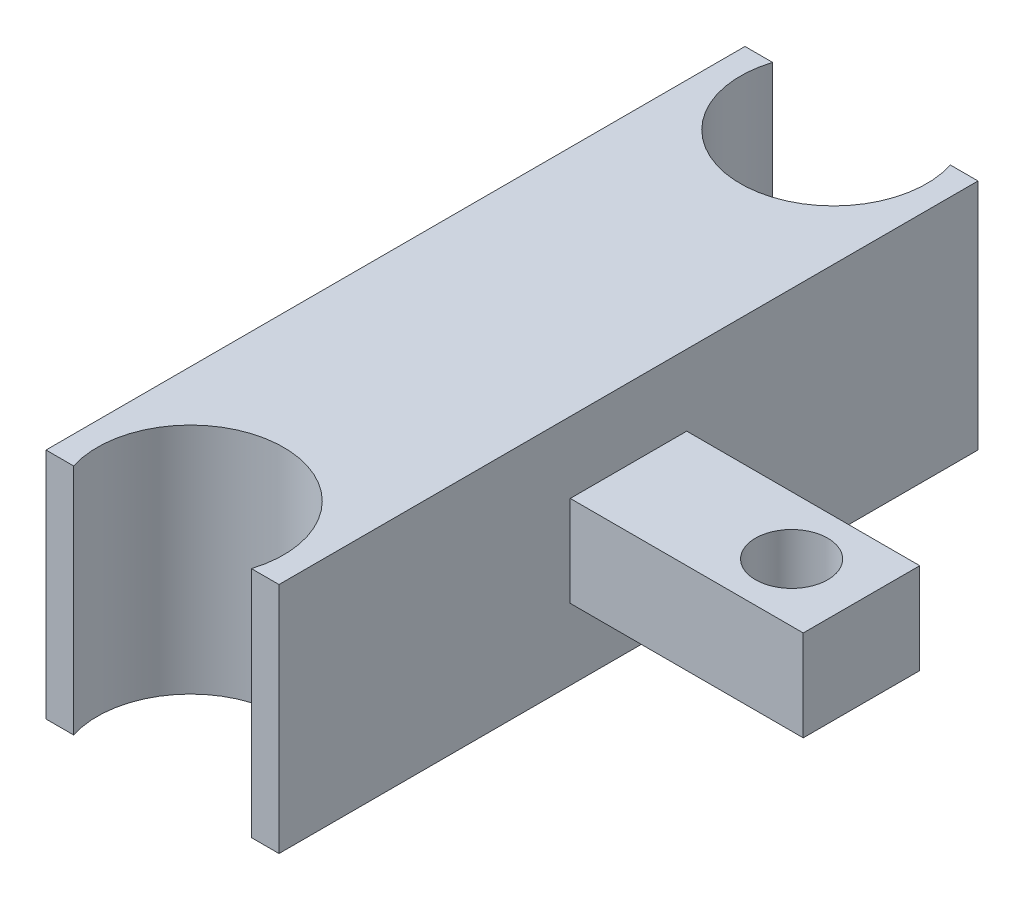
ISO-10303-21;
HEADER;
FILE_DESCRIPTION(('STEP AP214'),'2;1');
FILE_NAME('part.step','',(''),(''),'','','');
FILE_SCHEMA(('AUTOMOTIVE_DESIGN { 1 0 10303 214 1 1 1 1 }'));
ENDSEC;
DATA;
#1=APPLICATION_CONTEXT('core data for automotive mechanical design processes');
#2=APPLICATION_PROTOCOL_DEFINITION('international standard','automotive_design',2000,#1);
#3=PRODUCT_CONTEXT('',#1,'mechanical');
#4=PRODUCT('Part','Part','',(#3));
#5=PRODUCT_RELATED_PRODUCT_CATEGORY('part','',(#4));
#6=PRODUCT_DEFINITION_FORMATION('','',#4);
#7=PRODUCT_DEFINITION_CONTEXT('part definition',#1,'design');
#8=PRODUCT_DEFINITION('design','',#6,#7);
#9=PRODUCT_DEFINITION_SHAPE('','',#8);
#10=(LENGTH_UNIT() NAMED_UNIT(*) SI_UNIT(.MILLI.,.METRE.));
#11=(NAMED_UNIT(*) PLANE_ANGLE_UNIT() SI_UNIT($,.RADIAN.));
#12=(NAMED_UNIT(*) SI_UNIT($,.STERADIAN.) SOLID_ANGLE_UNIT());
#13=UNCERTAINTY_MEASURE_WITH_UNIT(LENGTH_MEASURE(1.E-05),#10,'distance_accuracy_value','');
#14=(GEOMETRIC_REPRESENTATION_CONTEXT(3) GLOBAL_UNCERTAINTY_ASSIGNED_CONTEXT((#13)) GLOBAL_UNIT_ASSIGNED_CONTEXT((#10,
#11,#12)) REPRESENTATION_CONTEXT('',''));
#15=CARTESIAN_POINT('',(0.,0.,0.));
#16=DIRECTION('',(0.,0.,1.));
#17=DIRECTION('',(1.,0.,0.));
#18=AXIS2_PLACEMENT_3D('',#15,#16,#17);
#19=CARTESIAN_POINT('',(-10.,-3.05,-17.5));
#20=DIRECTION('',(0.,0.,1.));
#21=DIRECTION('',(1.,0.,0.));
#22=AXIS2_PLACEMENT_3D('',#19,#20,#21);
#23=PLANE('',#22);
#24=DIRECTION('',(1.,0.,0.));
#25=VECTOR('',#24,1.);
#26=CARTESIAN_POINT('',(-10.,-3.05,-17.5));
#27=LINE('',#26,#25);
#28=CARTESIAN_POINT('',(-1.18424319433222,-3.05,-17.5));
#29=VERTEX_POINT('',#28);
#30=CARTESIAN_POINT('',(0.,-3.05,-17.5));
#31=VERTEX_POINT('',#30);
#32=EDGE_CURVE('E148',#29,#31,#27,.T.);
#33=ORIENTED_EDGE('',*,*,#32,.F.);
#34=DIRECTION('',(0.,1.,0.));
#35=VECTOR('',#34,1.);
#36=CARTESIAN_POINT('',(-1.18424319433222,-3.05,-17.5));
#37=LINE('',#36,#35);
#38=CARTESIAN_POINT('',(-1.18424319433222,6.95,-17.5));
#39=VERTEX_POINT('',#38);
#40=EDGE_CURVE('E267',#29,#39,#37,.T.);
#41=ORIENTED_EDGE('',*,*,#40,.T.);
#42=DIRECTION('',(1.,0.,0.));
#43=VECTOR('',#42,1.);
#44=CARTESIAN_POINT('',(-10.,6.95,-17.5));
#45=LINE('',#44,#43);
#46=CARTESIAN_POINT('',(0.,6.95,-17.5));
#47=VERTEX_POINT('',#46);
#48=EDGE_CURVE('E255',#39,#47,#45,.T.);
#49=ORIENTED_EDGE('',*,*,#48,.T.);
#50=DIRECTION('',(0.,-1.,0.));
#51=VECTOR('',#50,1.);
#52=CARTESIAN_POINT('',(0.,-3.05,-17.5));
#53=LINE('',#52,#51);
#54=EDGE_CURVE('E264',#47,#31,#53,.T.);
#55=ORIENTED_EDGE('',*,*,#54,.T.);
#56=EDGE_LOOP('',(#33,#41,#49,#55));
#57=FACE_BOUND('',#56,.T.);
#58=ADVANCED_FACE('F35',(#57),#23,.F.);
#59=CARTESIAN_POINT('',(-10.,-3.05,12.5));
#60=DIRECTION('',(0.,0.,-1.));
#61=DIRECTION('',(-1.,0.,0.));
#62=AXIS2_PLACEMENT_3D('',#59,#60,#61);
#63=PLANE('',#62);
#64=DIRECTION('',(1.,0.,0.));
#65=VECTOR('',#64,1.);
#66=CARTESIAN_POINT('',(-10.,-3.05,12.5));
#67=LINE('',#66,#65);
#68=CARTESIAN_POINT('',(-10.,-3.05,12.5));
#69=VERTEX_POINT('',#68);
#70=CARTESIAN_POINT('',(-8.81575680566778,-3.05,12.5));
#71=VERTEX_POINT('',#70);
#72=EDGE_CURVE('E145',#69,#71,#67,.T.);
#73=ORIENTED_EDGE('',*,*,#72,.T.);
#74=DIRECTION('',(0.,1.,0.));
#75=VECTOR('',#74,1.);
#76=CARTESIAN_POINT('',(-8.81575680566778,-3.05,12.5));
#77=LINE('',#76,#75);
#78=CARTESIAN_POINT('',(-8.81575680566778,6.95,12.5));
#79=VERTEX_POINT('',#78);
#80=EDGE_CURVE('E124',#71,#79,#77,.T.);
#81=ORIENTED_EDGE('',*,*,#80,.T.);
#82=DIRECTION('',(1.,0.,0.));
#83=VECTOR('',#82,1.);
#84=CARTESIAN_POINT('',(-10.,6.95,12.5));
#85=LINE('',#84,#83);
#86=CARTESIAN_POINT('',(-10.,6.95,12.5));
#87=VERTEX_POINT('',#86);
#88=EDGE_CURVE('E146',#87,#79,#85,.T.);
#89=ORIENTED_EDGE('',*,*,#88,.F.);
#90=DIRECTION('',(0.,1.,0.));
#91=VECTOR('',#90,1.);
#92=CARTESIAN_POINT('',(-10.,-3.05,12.5));
#93=LINE('',#92,#91);
#94=EDGE_CURVE('E269',#69,#87,#93,.T.);
#95=ORIENTED_EDGE('',*,*,#94,.F.);
#96=EDGE_LOOP('',(#73,#81,#89,#95));
#97=FACE_BOUND('',#96,.T.);
#98=ADVANCED_FACE('F212',(#97),#63,.F.);
#99=CARTESIAN_POINT('',(0.,3.9,0.));
#100=DIRECTION('',(0.,-1.,0.));
#101=DIRECTION('',(0.,0.,-1.));
#102=AXIS2_PLACEMENT_3D('',#99,#100,#101);
#103=PLANE('',#102);
#104=DIRECTION('',(0.,0.,1.));
#105=VECTOR('',#104,1.);
#106=CARTESIAN_POINT('',(0.,3.9,0.));
#107=LINE('',#106,#105);
#108=CARTESIAN_POINT('',(0.,3.9,-5.));
#109=VERTEX_POINT('',#108);
#110=CARTESIAN_POINT('',(0.,3.9,0.));
#111=VERTEX_POINT('',#110);
#112=EDGE_CURVE('E162',#109,#111,#107,.T.);
#113=ORIENTED_EDGE('',*,*,#112,.T.);
#114=DIRECTION('',(1.,0.,0.));
#115=VECTOR('',#114,1.);
#116=CARTESIAN_POINT('',(0.,3.9,0.));
#117=LINE('',#116,#115);
#118=CARTESIAN_POINT('',(10.,3.9,0.));
#119=VERTEX_POINT('',#118);
#120=EDGE_CURVE('E165',#111,#119,#117,.T.);
#121=ORIENTED_EDGE('',*,*,#120,.T.);
#122=DIRECTION('',(0.,0.,-1.));
#123=VECTOR('',#122,1.);
#124=CARTESIAN_POINT('',(10.,3.9,0.));
#125=LINE('',#124,#123);
#126=CARTESIAN_POINT('',(10.,3.9,-5.));
#127=VERTEX_POINT('',#126);
#128=EDGE_CURVE('E168',#119,#127,#125,.T.);
#129=ORIENTED_EDGE('',*,*,#128,.T.);
#130=DIRECTION('',(-1.,0.,0.));
#131=VECTOR('',#130,1.);
#132=CARTESIAN_POINT('',(0.,3.9,-5.));
#133=LINE('',#132,#131);
#134=EDGE_CURVE('E170',#127,#109,#133,.T.);
#135=ORIENTED_EDGE('',*,*,#134,.T.);
#136=EDGE_LOOP('',(#113,#121,#129,#135));
#137=FACE_BOUND('',#136,.T.);
#138=CARTESIAN_POINT('',(7.,3.9,-2.5));
#139=DIRECTION('',(0.,1.,0.));
#140=DIRECTION('',(0.,0.,1.));
#141=AXIS2_PLACEMENT_3D('',#138,#139,#140);
#142=CIRCLE('',#141,1.55);
#143=CARTESIAN_POINT('',(7.,3.9,-0.95));
#144=VERTEX_POINT('',#143);
#145=EDGE_CURVE('E156',#144,#144,#142,.T.);
#146=ORIENTED_EDGE('',*,*,#145,.F.);
#147=EDGE_LOOP('',(#146));
#148=FACE_BOUND('',#147,.T.);
#149=ADVANCED_FACE('F209',(#137,#148),#103,.F.);
#150=CARTESIAN_POINT('',(0.,0.,0.));
#151=DIRECTION('',(0.,-1.,0.));
#152=DIRECTION('',(0.,0.,-1.));
#153=AXIS2_PLACEMENT_3D('',#150,#151,#152);
#154=PLANE('',#153);
#155=DIRECTION('',(0.,0.,1.));
#156=VECTOR('',#155,1.);
#157=CARTESIAN_POINT('',(0.,0.,0.));
#158=LINE('',#157,#156);
#159=CARTESIAN_POINT('',(0.,0.,-5.));
#160=VERTEX_POINT('',#159);
#161=CARTESIAN_POINT('',(0.,0.,0.));
#162=VERTEX_POINT('',#161);
#163=EDGE_CURVE('E159',#160,#162,#158,.T.);
#164=ORIENTED_EDGE('',*,*,#163,.F.);
#165=DIRECTION('',(-1.,0.,0.));
#166=VECTOR('',#165,1.);
#167=CARTESIAN_POINT('',(0.,0.,-5.));
#168=LINE('',#167,#166);
#169=CARTESIAN_POINT('',(10.,0.,-5.));
#170=VERTEX_POINT('',#169);
#171=EDGE_CURVE('E166',#170,#160,#168,.T.);
#172=ORIENTED_EDGE('',*,*,#171,.F.);
#173=DIRECTION('',(0.,0.,-1.));
#174=VECTOR('',#173,1.);
#175=CARTESIAN_POINT('',(10.,0.,0.));
#176=LINE('',#175,#174);
#177=CARTESIAN_POINT('',(10.,0.,0.));
#178=VERTEX_POINT('',#177);
#179=EDGE_CURVE('E177',#178,#170,#176,.T.);
#180=ORIENTED_EDGE('',*,*,#179,.F.);
#181=DIRECTION('',(1.,0.,0.));
#182=VECTOR('',#181,1.);
#183=CARTESIAN_POINT('',(0.,0.,0.));
#184=LINE('',#183,#182);
#185=EDGE_CURVE('E175',#162,#178,#184,.T.);
#186=ORIENTED_EDGE('',*,*,#185,.F.);
#187=EDGE_LOOP('',(#164,#172,#180,#186));
#188=FACE_BOUND('',#187,.T.);
#189=CARTESIAN_POINT('',(7.,0.,-2.5));
#190=DIRECTION('',(0.,1.,0.));
#191=DIRECTION('',(0.,0.,1.));
#192=AXIS2_PLACEMENT_3D('',#189,#190,#191);
#193=CIRCLE('',#192,1.55);
#194=CARTESIAN_POINT('',(7.,0.,-0.95));
#195=VERTEX_POINT('',#194);
#196=EDGE_CURVE('E155',#195,#195,#193,.T.);
#197=ORIENTED_EDGE('',*,*,#196,.T.);
#198=EDGE_LOOP('',(#197));
#199=FACE_BOUND('',#198,.T.);
#200=ADVANCED_FACE('F198',(#188,#199),#154,.T.);
#201=CARTESIAN_POINT('',(0.,3.9,0.));
#202=DIRECTION('',(0.,0.,-1.));
#203=DIRECTION('',(-1.,0.,0.));
#204=AXIS2_PLACEMENT_3D('',#201,#202,#203);
#205=PLANE('',#204);
#206=ORIENTED_EDGE('',*,*,#185,.T.);
#207=DIRECTION('',(0.,-1.,0.));
#208=VECTOR('',#207,1.);
#209=CARTESIAN_POINT('',(10.,3.9,0.));
#210=LINE('',#209,#208);
#211=EDGE_CURVE('E186',#119,#178,#210,.T.);
#212=ORIENTED_EDGE('',*,*,#211,.F.);
#213=ORIENTED_EDGE('',*,*,#120,.F.);
#214=DIRECTION('',(0.,-1.,0.));
#215=VECTOR('',#214,1.);
#216=CARTESIAN_POINT('',(0.,3.9,0.));
#217=LINE('',#216,#215);
#218=EDGE_CURVE('E43',#111,#162,#217,.T.);
#219=ORIENTED_EDGE('',*,*,#218,.T.);
#220=EDGE_LOOP('',(#206,#212,#213,#219));
#221=FACE_BOUND('',#220,.T.);
#222=ADVANCED_FACE('F37',(#221),#205,.F.);
#223=CARTESIAN_POINT('',(10.,3.9,0.));
#224=DIRECTION('',(-1.,0.,0.));
#225=DIRECTION('',(0.,0.,1.));
#226=AXIS2_PLACEMENT_3D('',#223,#224,#225);
#227=PLANE('',#226);
#228=ORIENTED_EDGE('',*,*,#179,.T.);
#229=DIRECTION('',(0.,-1.,0.));
#230=VECTOR('',#229,1.);
#231=CARTESIAN_POINT('',(10.,3.9,-5.));
#232=LINE('',#231,#230);
#233=EDGE_CURVE('E183',#127,#170,#232,.T.);
#234=ORIENTED_EDGE('',*,*,#233,.F.);
#235=ORIENTED_EDGE('',*,*,#128,.F.);
#236=ORIENTED_EDGE('',*,*,#211,.T.);
#237=EDGE_LOOP('',(#228,#234,#235,#236));
#238=FACE_BOUND('',#237,.T.);
#239=ADVANCED_FACE('F207',(#238),#227,.F.);
#240=CARTESIAN_POINT('',(0.,3.9,-5.));
#241=DIRECTION('',(0.,0.,1.));
#242=DIRECTION('',(1.,0.,0.));
#243=AXIS2_PLACEMENT_3D('',#240,#241,#242);
#244=PLANE('',#243);
#245=ORIENTED_EDGE('',*,*,#171,.T.);
#246=DIRECTION('',(0.,-1.,0.));
#247=VECTOR('',#246,1.);
#248=CARTESIAN_POINT('',(0.,3.9,-5.));
#249=LINE('',#248,#247);
#250=EDGE_CURVE('E172',#109,#160,#249,.T.);
#251=ORIENTED_EDGE('',*,*,#250,.F.);
#252=ORIENTED_EDGE('',*,*,#134,.F.);
#253=ORIENTED_EDGE('',*,*,#233,.T.);
#254=EDGE_LOOP('',(#245,#251,#252,#253));
#255=FACE_BOUND('',#254,.T.);
#256=ADVANCED_FACE('F202',(#255),#244,.F.);
#257=CARTESIAN_POINT('',(7.,3.9,-2.5));
#258=DIRECTION('',(0.,-1.,0.));
#259=DIRECTION('',(0.,0.,-1.));
#260=AXIS2_PLACEMENT_3D('',#257,#258,#259);
#261=CYLINDRICAL_SURFACE('',#260,1.55);
#262=ORIENTED_EDGE('',*,*,#145,.T.);
#263=EDGE_LOOP('',(#262));
#264=FACE_BOUND('',#263,.T.);
#265=ORIENTED_EDGE('',*,*,#196,.F.);
#266=EDGE_LOOP('',(#265));
#267=FACE_BOUND('',#266,.T.);
#268=ADVANCED_FACE('F216',(#264,#267),#261,.F.);
#269=CARTESIAN_POINT('',(0.,0.,0.));
#270=DIRECTION('',(-1.,0.,0.));
#271=DIRECTION('',(0.,0.,1.));
#272=AXIS2_PLACEMENT_3D('',#269,#270,#271);
#273=PLANE('',#272);
#274=ORIENTED_EDGE('',*,*,#54,.F.);
#275=DIRECTION('',(0.,0.,-1.));
#276=VECTOR('',#275,1.);
#277=CARTESIAN_POINT('',(0.,6.95,12.5));
#278=LINE('',#277,#276);
#279=CARTESIAN_POINT('',(0.,6.95,12.5));
#280=VERTEX_POINT('',#279);
#281=EDGE_CURVE('E258',#280,#47,#278,.T.);
#282=ORIENTED_EDGE('',*,*,#281,.F.);
#283=DIRECTION('',(0.,1.,0.));
#284=VECTOR('',#283,1.);
#285=CARTESIAN_POINT('',(0.,-3.05,12.5));
#286=LINE('',#285,#284);
#287=CARTESIAN_POINT('',(0.,-3.05,12.5));
#288=VERTEX_POINT('',#287);
#289=EDGE_CURVE('E261',#288,#280,#286,.T.);
#290=ORIENTED_EDGE('',*,*,#289,.F.);
#291=DIRECTION('',(0.,0.,1.));
#292=VECTOR('',#291,1.);
#293=CARTESIAN_POINT('',(0.,-3.05,12.5));
#294=LINE('',#293,#292);
#295=EDGE_CURVE('E143',#31,#288,#294,.T.);
#296=ORIENTED_EDGE('',*,*,#295,.F.);
#297=EDGE_LOOP('',(#274,#282,#290,#296));
#298=FACE_BOUND('',#297,.T.);
#299=ORIENTED_EDGE('',*,*,#250,.T.);
#300=ORIENTED_EDGE('',*,*,#163,.T.);
#301=ORIENTED_EDGE('',*,*,#218,.F.);
#302=ORIENTED_EDGE('',*,*,#112,.F.);
#303=EDGE_LOOP('',(#299,#300,#301,#302));
#304=FACE_BOUND('',#303,.T.);
#305=ADVANCED_FACE('F194',(#298,#304),#273,.F.);
#306=CARTESIAN_POINT('',(-10.,6.95,-17.5));
#307=VERTEX_POINT('',#306);
#308=CARTESIAN_POINT('',(-8.81575680566778,6.95,-17.5));
#309=VERTEX_POINT('',#308);
#310=EDGE_CURVE('E249',#307,#309,#45,.T.);
#311=ORIENTED_EDGE('',*,*,#310,.T.);
#312=DIRECTION('',(0.,1.,0.));
#313=VECTOR('',#312,1.);
#314=CARTESIAN_POINT('',(-8.81575680566778,-3.05,-17.5));
#315=LINE('',#314,#313);
#316=CARTESIAN_POINT('',(-8.81575680566778,-3.05,-17.5));
#317=VERTEX_POINT('',#316);
#318=EDGE_CURVE('E58',#309,#317,#315,.F.);
#319=ORIENTED_EDGE('',*,*,#318,.T.);
#320=CARTESIAN_POINT('',(-10.,-3.05,-17.5));
#321=VERTEX_POINT('',#320);
#322=EDGE_CURVE('E153',#321,#317,#27,.T.);
#323=ORIENTED_EDGE('',*,*,#322,.F.);
#324=DIRECTION('',(0.,-1.,0.));
#325=VECTOR('',#324,1.);
#326=CARTESIAN_POINT('',(-10.,-3.05,-17.5));
#327=LINE('',#326,#325);
#328=EDGE_CURVE('E252',#307,#321,#327,.T.);
#329=ORIENTED_EDGE('',*,*,#328,.F.);
#330=EDGE_LOOP('',(#311,#319,#323,#329));
#331=FACE_BOUND('',#330,.T.);
#332=ADVANCED_FACE('F230',(#331),#23,.F.);
#333=CARTESIAN_POINT('',(-10.,-3.05,12.5));
#334=DIRECTION('',(0.,1.,0.));
#335=DIRECTION('',(0.,0.,1.));
#336=AXIS2_PLACEMENT_3D('',#333,#334,#335);
#337=PLANE('',#336);
#338=ORIENTED_EDGE('',*,*,#322,.T.);
#339=CARTESIAN_POINT('',(-5.,-3.05,-16.3));
#340=DIRECTION('',(0.,1.,0.));
#341=DIRECTION('',(0.,0.,1.));
#342=AXIS2_PLACEMENT_3D('',#339,#340,#341);
#343=CIRCLE('',#342,4.);
#344=EDGE_CURVE('E138',#317,#29,#343,.T.);
#345=ORIENTED_EDGE('',*,*,#344,.T.);
#346=ORIENTED_EDGE('',*,*,#32,.T.);
#347=ORIENTED_EDGE('',*,*,#295,.T.);
#348=CARTESIAN_POINT('',(-1.18424319433221,-3.05,12.5));
#349=VERTEX_POINT('',#348);
#350=EDGE_CURVE('E135',#349,#288,#67,.T.);
#351=ORIENTED_EDGE('',*,*,#350,.F.);
#352=CARTESIAN_POINT('',(-5.,-3.05,11.3));
#353=DIRECTION('',(0.,1.,0.));
#354=DIRECTION('',(0.,0.,1.));
#355=AXIS2_PLACEMENT_3D('',#352,#353,#354);
#356=CIRCLE('',#355,4.);
#357=EDGE_CURVE('E121',#349,#71,#356,.T.);
#358=ORIENTED_EDGE('',*,*,#357,.T.);
#359=ORIENTED_EDGE('',*,*,#72,.F.);
#360=DIRECTION('',(0.,0.,1.));
#361=VECTOR('',#360,1.);
#362=CARTESIAN_POINT('',(-10.,-3.05,12.5));
#363=LINE('',#362,#361);
#364=EDGE_CURVE('E271',#321,#69,#363,.T.);
#365=ORIENTED_EDGE('',*,*,#364,.F.);
#366=EDGE_LOOP('',(#338,#345,#346,#347,#351,#358,#359,#365));
#367=FACE_BOUND('',#366,.T.);
#368=ADVANCED_FACE('F141',(#367),#337,.F.);
#369=CARTESIAN_POINT('',(-1.18424319433221,6.95,12.5));
#370=VERTEX_POINT('',#369);
#371=EDGE_CURVE('E137',#370,#280,#85,.T.);
#372=ORIENTED_EDGE('',*,*,#371,.F.);
#373=DIRECTION('',(0.,1.,0.));
#374=VECTOR('',#373,1.);
#375=CARTESIAN_POINT('',(-1.18424319433221,-3.05,12.5));
#376=LINE('',#375,#374);
#377=EDGE_CURVE('E50',#370,#349,#376,.F.);
#378=ORIENTED_EDGE('',*,*,#377,.T.);
#379=ORIENTED_EDGE('',*,*,#350,.T.);
#380=ORIENTED_EDGE('',*,*,#289,.T.);
#381=EDGE_LOOP('',(#372,#378,#379,#380));
#382=FACE_BOUND('',#381,.T.);
#383=ADVANCED_FACE('F133',(#382),#63,.F.);
#384=CARTESIAN_POINT('',(-10.,6.95,12.5));
#385=DIRECTION('',(0.,-1.,0.));
#386=DIRECTION('',(0.,0.,-1.));
#387=AXIS2_PLACEMENT_3D('',#384,#385,#386);
#388=PLANE('',#387);
#389=ORIENTED_EDGE('',*,*,#48,.F.);
#390=CARTESIAN_POINT('',(-5.,6.95,-16.3));
#391=DIRECTION('',(0.,-1.,0.));
#392=DIRECTION('',(0.,0.,-1.));
#393=AXIS2_PLACEMENT_3D('',#390,#391,#392);
#394=CIRCLE('',#393,4.);
#395=EDGE_CURVE('E11',#39,#309,#394,.T.);
#396=ORIENTED_EDGE('',*,*,#395,.T.);
#397=ORIENTED_EDGE('',*,*,#310,.F.);
#398=DIRECTION('',(0.,0.,-1.));
#399=VECTOR('',#398,1.);
#400=CARTESIAN_POINT('',(-10.,6.95,12.5));
#401=LINE('',#400,#399);
#402=EDGE_CURVE('E256',#87,#307,#401,.T.);
#403=ORIENTED_EDGE('',*,*,#402,.F.);
#404=ORIENTED_EDGE('',*,*,#88,.T.);
#405=CARTESIAN_POINT('',(-5.,6.95,11.3));
#406=DIRECTION('',(0.,1.,0.));
#407=DIRECTION('',(0.,0.,1.));
#408=AXIS2_PLACEMENT_3D('',#405,#406,#407);
#409=CIRCLE('',#408,4.);
#410=EDGE_CURVE('E129',#370,#79,#409,.T.);
#411=ORIENTED_EDGE('',*,*,#410,.F.);
#412=ORIENTED_EDGE('',*,*,#371,.T.);
#413=ORIENTED_EDGE('',*,*,#281,.T.);
#414=EDGE_LOOP('',(#389,#396,#397,#403,#404,#411,#412,#413));
#415=FACE_BOUND('',#414,.T.);
#416=ADVANCED_FACE('F283',(#415),#388,.F.);
#417=CARTESIAN_POINT('',(-10.,0.,0.));
#418=DIRECTION('',(-1.,0.,0.));
#419=DIRECTION('',(0.,0.,1.));
#420=AXIS2_PLACEMENT_3D('',#417,#418,#419);
#421=PLANE('',#420);
#422=ORIENTED_EDGE('',*,*,#328,.T.);
#423=ORIENTED_EDGE('',*,*,#364,.T.);
#424=ORIENTED_EDGE('',*,*,#94,.T.);
#425=ORIENTED_EDGE('',*,*,#402,.T.);
#426=EDGE_LOOP('',(#422,#423,#424,#425));
#427=FACE_BOUND('',#426,.T.);
#428=ADVANCED_FACE('F287',(#427),#421,.T.);
#429=CARTESIAN_POINT('',(-5.,-3.05,11.3));
#430=DIRECTION('',(0.,1.,0.));
#431=DIRECTION('',(0.,0.,1.));
#432=AXIS2_PLACEMENT_3D('',#429,#430,#431);
#433=CYLINDRICAL_SURFACE('',#432,4.);
#434=ORIENTED_EDGE('',*,*,#357,.F.);
#435=ORIENTED_EDGE('',*,*,#377,.F.);
#436=ORIENTED_EDGE('',*,*,#410,.T.);
#437=ORIENTED_EDGE('',*,*,#80,.F.);
#438=EDGE_LOOP('',(#434,#435,#436,#437));
#439=FACE_BOUND('',#438,.T.);
#440=ADVANCED_FACE('F122',(#439),#433,.F.);
#441=CARTESIAN_POINT('',(-5.,-3.05,-16.3));
#442=DIRECTION('',(0.,1.,0.));
#443=DIRECTION('',(0.,0.,1.));
#444=AXIS2_PLACEMENT_3D('',#441,#442,#443);
#445=CYLINDRICAL_SURFACE('',#444,4.);
#446=ORIENTED_EDGE('',*,*,#344,.F.);
#447=ORIENTED_EDGE('',*,*,#318,.F.);
#448=ORIENTED_EDGE('',*,*,#395,.F.);
#449=ORIENTED_EDGE('',*,*,#40,.F.);
#450=EDGE_LOOP('',(#446,#447,#448,#449));
#451=FACE_BOUND('',#450,.T.);
#452=ADVANCED_FACE('F294',(#451),#445,.F.);
#453=CLOSED_SHELL('',(#58,#98,#149,#200,#222,#239,#256,#268,#305,#332,#368,#383,#416,#428,#440,#452));
#454=MANIFOLD_SOLID_BREP('B2',#453);
#455=ADVANCED_BREP_SHAPE_REPRESENTATION('',(#18,#454),#14);
#456=SHAPE_DEFINITION_REPRESENTATION(#9,#455);
ENDSEC;
END-ISO-10303-21;
